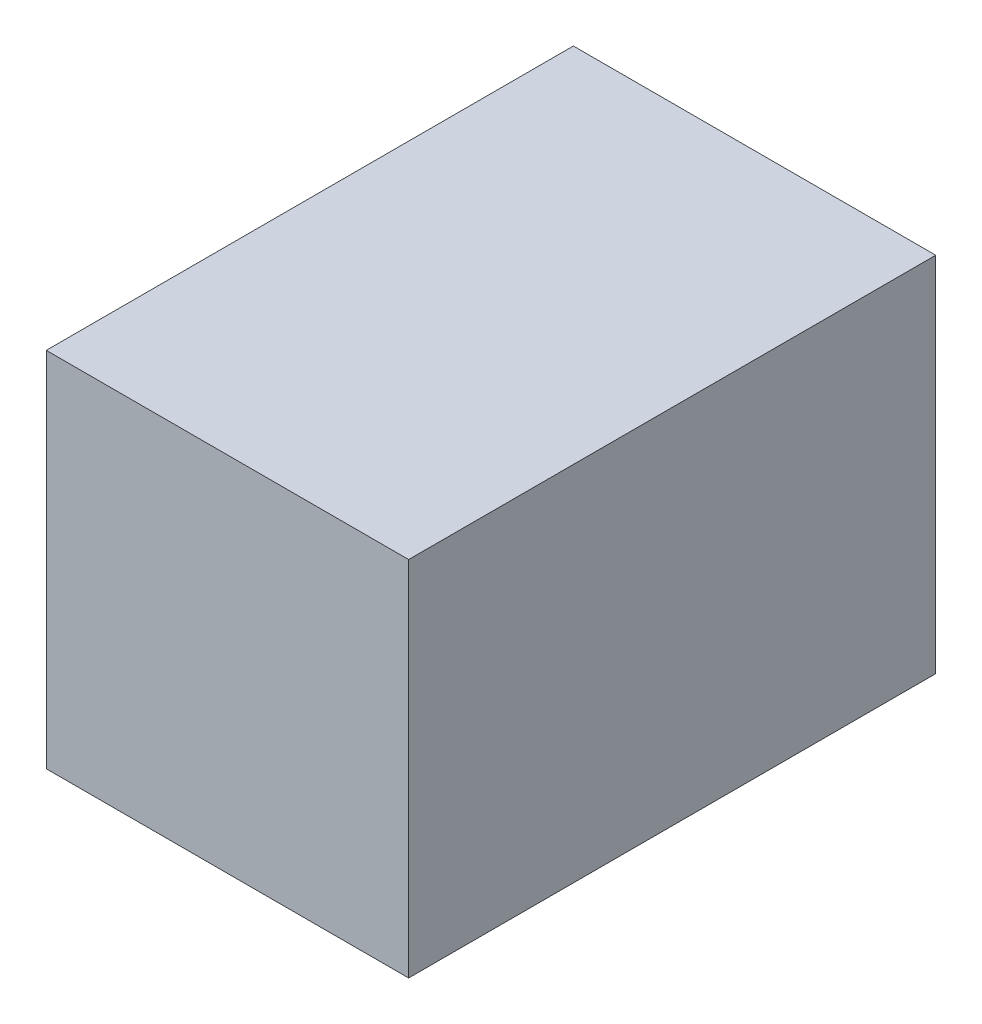
ISO-10303-21;
HEADER;
FILE_DESCRIPTION(('STEP AP214'),'2;1');
FILE_NAME('part.step','',(''),(''),'','','');
FILE_SCHEMA(('AUTOMOTIVE_DESIGN { 1 0 10303 214 1 1 1 1 }'));
ENDSEC;
DATA;
#1=APPLICATION_CONTEXT('core data for automotive mechanical design processes');
#2=APPLICATION_PROTOCOL_DEFINITION('international standard','automotive_design',2000,#1);
#3=PRODUCT_CONTEXT('',#1,'mechanical');
#4=PRODUCT('Part','Part','',(#3));
#5=PRODUCT_RELATED_PRODUCT_CATEGORY('part','',(#4));
#6=PRODUCT_DEFINITION_FORMATION('','',#4);
#7=PRODUCT_DEFINITION_CONTEXT('part definition',#1,'design');
#8=PRODUCT_DEFINITION('design','',#6,#7);
#9=PRODUCT_DEFINITION_SHAPE('','',#8);
#10=(LENGTH_UNIT() NAMED_UNIT(*) SI_UNIT(.MILLI.,.METRE.));
#11=(NAMED_UNIT(*) PLANE_ANGLE_UNIT() SI_UNIT($,.RADIAN.));
#12=(NAMED_UNIT(*) SI_UNIT($,.STERADIAN.) SOLID_ANGLE_UNIT());
#13=UNCERTAINTY_MEASURE_WITH_UNIT(LENGTH_MEASURE(1.E-05),#10,'distance_accuracy_value','');
#14=(GEOMETRIC_REPRESENTATION_CONTEXT(3) GLOBAL_UNCERTAINTY_ASSIGNED_CONTEXT((#13)) GLOBAL_UNIT_ASSIGNED_CONTEXT((#10,
#11,#12)) REPRESENTATION_CONTEXT('',''));
#15=CARTESIAN_POINT('',(0.,0.,0.));
#16=DIRECTION('',(0.,0.,1.));
#17=DIRECTION('',(1.,0.,0.));
#18=AXIS2_PLACEMENT_3D('',#15,#16,#17);
#19=CARTESIAN_POINT('',(13.75,13.75,40.));
#20=DIRECTION('',(0.,-1.,0.));
#21=DIRECTION('',(0.,0.,-1.));
#22=AXIS2_PLACEMENT_3D('',#19,#20,#21);
#23=PLANE('',#22);
#24=DIRECTION('',(-1.,0.,0.));
#25=VECTOR('',#24,1.);
#26=CARTESIAN_POINT('',(13.75,13.75,0.));
#27=LINE('',#26,#25);
#28=CARTESIAN_POINT('',(13.75,13.75,0.));
#29=VERTEX_POINT('',#28);
#30=CARTESIAN_POINT('',(-13.75,13.75,0.));
#31=VERTEX_POINT('',#30);
#32=EDGE_CURVE('E101',#29,#31,#27,.T.);
#33=ORIENTED_EDGE('',*,*,#32,.T.);
#34=DIRECTION('',(0.,0.,-1.));
#35=VECTOR('',#34,1.);
#36=CARTESIAN_POINT('',(-13.75,13.75,40.));
#37=LINE('',#36,#35);
#38=CARTESIAN_POINT('',(-13.75,13.75,40.));
#39=VERTEX_POINT('',#38);
#40=EDGE_CURVE('E11',#39,#31,#37,.T.);
#41=ORIENTED_EDGE('',*,*,#40,.F.);
#42=DIRECTION('',(-1.,0.,0.));
#43=VECTOR('',#42,1.);
#44=CARTESIAN_POINT('',(13.75,13.75,40.));
#45=LINE('',#44,#43);
#46=CARTESIAN_POINT('',(13.75,13.75,40.));
#47=VERTEX_POINT('',#46);
#48=EDGE_CURVE('E89',#47,#39,#45,.T.);
#49=ORIENTED_EDGE('',*,*,#48,.F.);
#50=DIRECTION('',(0.,0.,-1.));
#51=VECTOR('',#50,1.);
#52=CARTESIAN_POINT('',(13.75,13.75,40.));
#53=LINE('',#52,#51);
#54=EDGE_CURVE('E97',#47,#29,#53,.T.);
#55=ORIENTED_EDGE('',*,*,#54,.T.);
#56=EDGE_LOOP('',(#33,#41,#49,#55));
#57=FACE_BOUND('',#56,.T.);
#58=ADVANCED_FACE('F38',(#57),#23,.F.);
#59=CARTESIAN_POINT('',(-13.75,-13.75,40.));
#60=DIRECTION('',(1.,0.,0.));
#61=DIRECTION('',(0.,0.,-1.));
#62=AXIS2_PLACEMENT_3D('',#59,#60,#61);
#63=PLANE('',#62);
#64=DIRECTION('',(0.,-1.,0.));
#65=VECTOR('',#64,1.);
#66=CARTESIAN_POINT('',(-13.75,-13.75,0.));
#67=LINE('',#66,#65);
#68=CARTESIAN_POINT('',(-13.75,-13.75,0.));
#69=VERTEX_POINT('',#68);
#70=EDGE_CURVE('E93',#31,#69,#67,.T.);
#71=ORIENTED_EDGE('',*,*,#70,.T.);
#72=DIRECTION('',(0.,0.,-1.));
#73=VECTOR('',#72,1.);
#74=CARTESIAN_POINT('',(-13.75,-13.75,40.));
#75=LINE('',#74,#73);
#76=CARTESIAN_POINT('',(-13.75,-13.75,40.));
#77=VERTEX_POINT('',#76);
#78=EDGE_CURVE('E46',#77,#69,#75,.T.);
#79=ORIENTED_EDGE('',*,*,#78,.F.);
#80=DIRECTION('',(0.,-1.,0.));
#81=VECTOR('',#80,1.);
#82=CARTESIAN_POINT('',(-13.75,-13.75,40.));
#83=LINE('',#82,#81);
#84=EDGE_CURVE('E84',#39,#77,#83,.T.);
#85=ORIENTED_EDGE('',*,*,#84,.F.);
#86=ORIENTED_EDGE('',*,*,#40,.T.);
#87=EDGE_LOOP('',(#71,#79,#85,#86));
#88=FACE_BOUND('',#87,.T.);
#89=ADVANCED_FACE('F92',(#88),#63,.F.);
#90=CARTESIAN_POINT('',(13.75,-13.75,40.));
#91=DIRECTION('',(0.,1.,0.));
#92=DIRECTION('',(0.,0.,1.));
#93=AXIS2_PLACEMENT_3D('',#90,#91,#92);
#94=PLANE('',#93);
#95=DIRECTION('',(1.,0.,0.));
#96=VECTOR('',#95,1.);
#97=CARTESIAN_POINT('',(13.75,-13.75,0.));
#98=LINE('',#97,#96);
#99=CARTESIAN_POINT('',(13.75,-13.75,0.));
#100=VERTEX_POINT('',#99);
#101=EDGE_CURVE('E71',#69,#100,#98,.T.);
#102=ORIENTED_EDGE('',*,*,#101,.T.);
#103=DIRECTION('',(0.,0.,-1.));
#104=VECTOR('',#103,1.);
#105=CARTESIAN_POINT('',(13.75,-13.75,40.));
#106=LINE('',#105,#104);
#107=CARTESIAN_POINT('',(13.75,-13.75,40.));
#108=VERTEX_POINT('',#107);
#109=EDGE_CURVE('E94',#108,#100,#106,.T.);
#110=ORIENTED_EDGE('',*,*,#109,.F.);
#111=DIRECTION('',(1.,0.,0.));
#112=VECTOR('',#111,1.);
#113=CARTESIAN_POINT('',(13.75,-13.75,40.));
#114=LINE('',#113,#112);
#115=EDGE_CURVE('E87',#77,#108,#114,.T.);
#116=ORIENTED_EDGE('',*,*,#115,.F.);
#117=ORIENTED_EDGE('',*,*,#78,.T.);
#118=EDGE_LOOP('',(#102,#110,#116,#117));
#119=FACE_BOUND('',#118,.T.);
#120=ADVANCED_FACE('F95',(#119),#94,.F.);
#121=CARTESIAN_POINT('',(13.75,-13.75,40.));
#122=DIRECTION('',(-1.,0.,0.));
#123=DIRECTION('',(0.,0.,1.));
#124=AXIS2_PLACEMENT_3D('',#121,#122,#123);
#125=PLANE('',#124);
#126=DIRECTION('',(0.,1.,0.));
#127=VECTOR('',#126,1.);
#128=CARTESIAN_POINT('',(13.75,-13.75,0.));
#129=LINE('',#128,#127);
#130=EDGE_CURVE('E77',#100,#29,#129,.T.);
#131=ORIENTED_EDGE('',*,*,#130,.T.);
#132=ORIENTED_EDGE('',*,*,#54,.F.);
#133=DIRECTION('',(0.,1.,0.));
#134=VECTOR('',#133,1.);
#135=CARTESIAN_POINT('',(13.75,-13.75,40.));
#136=LINE('',#135,#134);
#137=EDGE_CURVE('E54',#108,#47,#136,.T.);
#138=ORIENTED_EDGE('',*,*,#137,.F.);
#139=ORIENTED_EDGE('',*,*,#109,.T.);
#140=EDGE_LOOP('',(#131,#132,#138,#139));
#141=FACE_BOUND('',#140,.T.);
#142=ADVANCED_FACE('F108',(#141),#125,.F.);
#143=CARTESIAN_POINT('',(0.,0.,40.));
#144=DIRECTION('',(0.,0.,-1.));
#145=DIRECTION('',(-1.,0.,0.));
#146=AXIS2_PLACEMENT_3D('',#143,#144,#145);
#147=PLANE('',#146);
#148=ORIENTED_EDGE('',*,*,#48,.T.);
#149=ORIENTED_EDGE('',*,*,#84,.T.);
#150=ORIENTED_EDGE('',*,*,#115,.T.);
#151=ORIENTED_EDGE('',*,*,#137,.T.);
#152=EDGE_LOOP('',(#148,#149,#150,#151));
#153=FACE_BOUND('',#152,.T.);
#154=ADVANCED_FACE('F85',(#153),#147,.F.);
#155=CARTESIAN_POINT('',(0.,0.,0.));
#156=DIRECTION('',(0.,0.,-1.));
#157=DIRECTION('',(-1.,0.,0.));
#158=AXIS2_PLACEMENT_3D('',#155,#156,#157);
#159=PLANE('',#158);
#160=ORIENTED_EDGE('',*,*,#32,.F.);
#161=ORIENTED_EDGE('',*,*,#130,.F.);
#162=ORIENTED_EDGE('',*,*,#101,.F.);
#163=ORIENTED_EDGE('',*,*,#70,.F.);
#164=EDGE_LOOP('',(#160,#161,#162,#163));
#165=FACE_BOUND('',#164,.T.);
#166=ADVANCED_FACE('F111',(#165),#159,.T.);
#167=CLOSED_SHELL('',(#58,#89,#120,#142,#154,#166));
#168=MANIFOLD_SOLID_BREP('B2',#167);
#169=ADVANCED_BREP_SHAPE_REPRESENTATION('',(#18,#168),#14);
#170=SHAPE_DEFINITION_REPRESENTATION(#9,#169);
ENDSEC;
END-ISO-10303-21;
